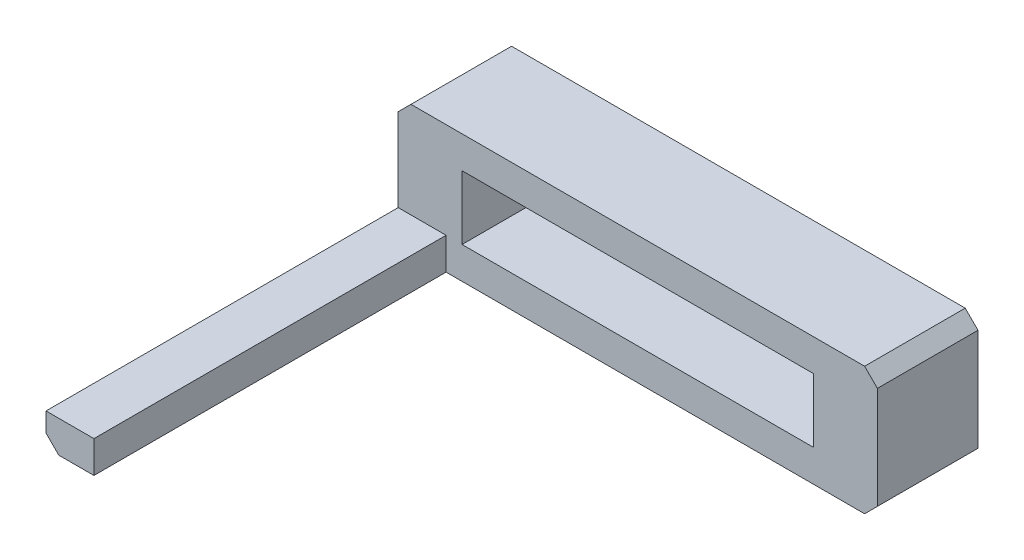
ISO-10303-21;
HEADER;
FILE_DESCRIPTION(('STEP AP214'),'2;1');
FILE_NAME('part.step','',(''),(''),'','','');
FILE_SCHEMA(('AUTOMOTIVE_DESIGN { 1 0 10303 214 1 1 1 1 }'));
ENDSEC;
DATA;
#1=APPLICATION_CONTEXT('core data for automotive mechanical design processes');
#2=APPLICATION_PROTOCOL_DEFINITION('international standard','automotive_design',2000,#1);
#3=PRODUCT_CONTEXT('',#1,'mechanical');
#4=PRODUCT('Part','Part','',(#3));
#5=PRODUCT_RELATED_PRODUCT_CATEGORY('part','',(#4));
#6=PRODUCT_DEFINITION_FORMATION('','',#4);
#7=PRODUCT_DEFINITION_CONTEXT('part definition',#1,'design');
#8=PRODUCT_DEFINITION('design','',#6,#7);
#9=PRODUCT_DEFINITION_SHAPE('','',#8);
#10=(LENGTH_UNIT() NAMED_UNIT(*) SI_UNIT(.MILLI.,.METRE.));
#11=(NAMED_UNIT(*) PLANE_ANGLE_UNIT() SI_UNIT($,.RADIAN.));
#12=(NAMED_UNIT(*) SI_UNIT($,.STERADIAN.) SOLID_ANGLE_UNIT());
#13=UNCERTAINTY_MEASURE_WITH_UNIT(LENGTH_MEASURE(1.E-05),#10,'distance_accuracy_value','');
#14=(GEOMETRIC_REPRESENTATION_CONTEXT(3) GLOBAL_UNCERTAINTY_ASSIGNED_CONTEXT((#13)) GLOBAL_UNIT_ASSIGNED_CONTEXT((#10,
#11,#12)) REPRESENTATION_CONTEXT('',''));
#15=CARTESIAN_POINT('',(0.,0.,0.));
#16=DIRECTION('',(0.,0.,1.));
#17=DIRECTION('',(1.,0.,0.));
#18=AXIS2_PLACEMENT_3D('',#15,#16,#17);
#19=CARTESIAN_POINT('',(-95.25,0.,20.));
#20=DIRECTION('',(-1.,0.,0.));
#21=DIRECTION('',(0.,0.,1.));
#22=AXIS2_PLACEMENT_3D('',#19,#20,#21);
#23=PLANE('',#22);
#24=DIRECTION('',(0.,1.,0.));
#25=VECTOR('',#24,1.);
#26=CARTESIAN_POINT('',(-95.25,0.,20.));
#27=LINE('',#26,#25);
#28=CARTESIAN_POINT('',(-95.25,6.35,20.));
#29=VERTEX_POINT('',#28);
#30=CARTESIAN_POINT('',(-95.25,22.86,20.));
#31=VERTEX_POINT('',#30);
#32=EDGE_CURVE('E190',#29,#31,#27,.T.);
#33=ORIENTED_EDGE('',*,*,#32,.T.);
#34=DIRECTION('',(0.,0.,-1.));
#35=VECTOR('',#34,1.);
#36=CARTESIAN_POINT('',(-95.25,22.86,0.));
#37=LINE('',#36,#35);
#38=CARTESIAN_POINT('',(-95.25,22.86,0.));
#39=VERTEX_POINT('',#38);
#40=EDGE_CURVE('E255',#31,#39,#37,.T.);
#41=ORIENTED_EDGE('',*,*,#40,.T.);
#42=DIRECTION('',(0.,1.,0.));
#43=VECTOR('',#42,1.);
#44=CARTESIAN_POINT('',(-95.25,0.,0.));
#45=LINE('',#44,#43);
#46=CARTESIAN_POINT('',(-95.25,2.54000000000001,0.));
#47=VERTEX_POINT('',#46);
#48=EDGE_CURVE('E211',#47,#39,#45,.T.);
#49=ORIENTED_EDGE('',*,*,#48,.F.);
#50=DIRECTION('',(0.,0.,1.));
#51=VECTOR('',#50,1.);
#52=CARTESIAN_POINT('',(-95.25,2.54000000000001,20.));
#53=LINE('',#52,#51);
#54=CARTESIAN_POINT('',(-95.25,2.54000000000001,90.));
#55=VERTEX_POINT('',#54);
#56=EDGE_CURVE('E56',#47,#55,#53,.T.);
#57=ORIENTED_EDGE('',*,*,#56,.T.);
#58=DIRECTION('',(0.,-1.,0.));
#59=VECTOR('',#58,1.);
#60=CARTESIAN_POINT('',(-95.25,0.,90.));
#61=LINE('',#60,#59);
#62=CARTESIAN_POINT('',(-95.25,6.35,90.));
#63=VERTEX_POINT('',#62);
#64=EDGE_CURVE('E148',#63,#55,#61,.T.);
#65=ORIENTED_EDGE('',*,*,#64,.F.);
#66=DIRECTION('',(0.,0.,-1.));
#67=VECTOR('',#66,1.);
#68=CARTESIAN_POINT('',(-95.25,6.35,90.));
#69=LINE('',#68,#67);
#70=EDGE_CURVE('E167',#63,#29,#69,.T.);
#71=ORIENTED_EDGE('',*,*,#70,.T.);
#72=EDGE_LOOP('',(#33,#41,#49,#57,#65,#71));
#73=FACE_BOUND('',#72,.T.);
#74=ADVANCED_FACE('F35',(#73),#23,.T.);
#75=CARTESIAN_POINT('',(0.,0.,20.));
#76=DIRECTION('',(0.,-1.,0.));
#77=DIRECTION('',(0.,0.,-1.));
#78=AXIS2_PLACEMENT_3D('',#75,#76,#77);
#79=PLANE('',#78);
#80=DIRECTION('',(-1.,0.,0.));
#81=VECTOR('',#80,1.);
#82=CARTESIAN_POINT('',(0.,0.,0.));
#83=LINE('',#82,#81);
#84=CARTESIAN_POINT('',(-2.53999999999999,0.,0.));
#85=VERTEX_POINT('',#84);
#86=CARTESIAN_POINT('',(-92.71,0.,0.));
#87=VERTEX_POINT('',#86);
#88=EDGE_CURVE('E214',#85,#87,#83,.T.);
#89=ORIENTED_EDGE('',*,*,#88,.F.);
#90=DIRECTION('',(0.,0.,1.));
#91=VECTOR('',#90,1.);
#92=CARTESIAN_POINT('',(-2.53999999999999,0.,20.));
#93=LINE('',#92,#91);
#94=CARTESIAN_POINT('',(-2.53999999999999,0.,20.));
#95=VERTEX_POINT('',#94);
#96=EDGE_CURVE('E43',#85,#95,#93,.T.);
#97=ORIENTED_EDGE('',*,*,#96,.T.);
#98=DIRECTION('',(-1.,0.,0.));
#99=VECTOR('',#98,1.);
#100=CARTESIAN_POINT('',(0.,0.,20.));
#101=LINE('',#100,#99);
#102=CARTESIAN_POINT('',(-85.725,0.,20.));
#103=VERTEX_POINT('',#102);
#104=EDGE_CURVE('E155',#95,#103,#101,.T.);
#105=ORIENTED_EDGE('',*,*,#104,.T.);
#106=DIRECTION('',(0.,0.,-1.));
#107=VECTOR('',#106,1.);
#108=CARTESIAN_POINT('',(-85.725,0.,90.));
#109=LINE('',#108,#107);
#110=CARTESIAN_POINT('',(-85.725,0.,90.));
#111=VERTEX_POINT('',#110);
#112=EDGE_CURVE('E151',#111,#103,#109,.T.);
#113=ORIENTED_EDGE('',*,*,#112,.F.);
#114=DIRECTION('',(1.,0.,0.));
#115=VECTOR('',#114,1.);
#116=CARTESIAN_POINT('',(-95.25,0.,90.));
#117=LINE('',#116,#115);
#118=CARTESIAN_POINT('',(-92.71,0.,90.));
#119=VERTEX_POINT('',#118);
#120=EDGE_CURVE('E139',#119,#111,#117,.T.);
#121=ORIENTED_EDGE('',*,*,#120,.F.);
#122=DIRECTION('',(0.,0.,-1.));
#123=VECTOR('',#122,1.);
#124=CARTESIAN_POINT('',(-92.71,0.,20.));
#125=LINE('',#124,#123);
#126=EDGE_CURVE('E258',#119,#87,#125,.T.);
#127=ORIENTED_EDGE('',*,*,#126,.T.);
#128=EDGE_LOOP('',(#89,#97,#105,#113,#121,#127));
#129=FACE_BOUND('',#128,.T.);
#130=ADVANCED_FACE('F153',(#129),#79,.T.);
#131=CARTESIAN_POINT('',(0.,0.,20.));
#132=DIRECTION('',(-1.,0.,0.));
#133=DIRECTION('',(0.,0.,1.));
#134=AXIS2_PLACEMENT_3D('',#131,#132,#133);
#135=PLANE('',#134);
#136=DIRECTION('',(0.,1.,0.));
#137=VECTOR('',#136,1.);
#138=CARTESIAN_POINT('',(0.,0.,0.));
#139=LINE('',#138,#137);
#140=CARTESIAN_POINT('',(0.,2.53999999999997,0.));
#141=VERTEX_POINT('',#140);
#142=CARTESIAN_POINT('',(0.,22.86,0.));
#143=VERTEX_POINT('',#142);
#144=EDGE_CURVE('E217',#141,#143,#139,.T.);
#145=ORIENTED_EDGE('',*,*,#144,.T.);
#146=DIRECTION('',(0.,0.,1.));
#147=VECTOR('',#146,1.);
#148=CARTESIAN_POINT('',(0.,22.86,20.));
#149=LINE('',#148,#147);
#150=CARTESIAN_POINT('',(0.,22.86,20.));
#151=VERTEX_POINT('',#150);
#152=EDGE_CURVE('E246',#143,#151,#149,.T.);
#153=ORIENTED_EDGE('',*,*,#152,.T.);
#154=DIRECTION('',(0.,1.,0.));
#155=VECTOR('',#154,1.);
#156=CARTESIAN_POINT('',(0.,0.,20.));
#157=LINE('',#156,#155);
#158=CARTESIAN_POINT('',(0.,2.53999999999997,20.));
#159=VERTEX_POINT('',#158);
#160=EDGE_CURVE('E194',#159,#151,#157,.T.);
#161=ORIENTED_EDGE('',*,*,#160,.F.);
#162=DIRECTION('',(0.,0.,-1.));
#163=VECTOR('',#162,1.);
#164=CARTESIAN_POINT('',(0.,2.53999999999997,0.));
#165=LINE('',#164,#163);
#166=EDGE_CURVE('E243',#159,#141,#165,.T.);
#167=ORIENTED_EDGE('',*,*,#166,.T.);
#168=EDGE_LOOP('',(#145,#153,#161,#167));
#169=FACE_BOUND('',#168,.T.);
#170=ADVANCED_FACE('F270',(#169),#135,.F.);
#171=CARTESIAN_POINT('',(-82.55,0.,20.));
#172=DIRECTION('',(1.,0.,0.));
#173=DIRECTION('',(0.,1.,0.));
#174=AXIS2_PLACEMENT_3D('',#171,#172,#173);
#175=PLANE('',#174);
#176=DIRECTION('',(0.,-1.,0.));
#177=VECTOR('',#176,1.);
#178=CARTESIAN_POINT('',(-82.55,0.,0.));
#179=LINE('',#178,#177);
#180=CARTESIAN_POINT('',(-82.55,19.05,0.));
#181=VERTEX_POINT('',#180);
#182=CARTESIAN_POINT('',(-82.55,6.34999999999999,0.));
#183=VERTEX_POINT('',#182);
#184=EDGE_CURVE('E159',#181,#183,#179,.T.);
#185=ORIENTED_EDGE('',*,*,#184,.F.);
#186=DIRECTION('',(0.,0.,-1.));
#187=VECTOR('',#186,1.);
#188=CARTESIAN_POINT('',(-82.55,19.05,20.));
#189=LINE('',#188,#187);
#190=CARTESIAN_POINT('',(-82.55,19.05,20.));
#191=VERTEX_POINT('',#190);
#192=EDGE_CURVE('E228',#191,#181,#189,.T.);
#193=ORIENTED_EDGE('',*,*,#192,.F.);
#194=DIRECTION('',(0.,-1.,0.));
#195=VECTOR('',#194,1.);
#196=CARTESIAN_POINT('',(-82.55,0.,20.));
#197=LINE('',#196,#195);
#198=CARTESIAN_POINT('',(-82.55,6.34999999999999,20.));
#199=VERTEX_POINT('',#198);
#200=EDGE_CURVE('E179',#191,#199,#197,.T.);
#201=ORIENTED_EDGE('',*,*,#200,.T.);
#202=DIRECTION('',(0.,0.,-1.));
#203=VECTOR('',#202,1.);
#204=CARTESIAN_POINT('',(-82.55,6.34999999999999,20.));
#205=LINE('',#204,#203);
#206=EDGE_CURVE('E200',#199,#183,#205,.T.);
#207=ORIENTED_EDGE('',*,*,#206,.T.);
#208=EDGE_LOOP('',(#185,#193,#201,#207));
#209=FACE_BOUND('',#208,.T.);
#210=ADVANCED_FACE('F311',(#209),#175,.T.);
#211=CARTESIAN_POINT('',(0.,19.05,20.));
#212=DIRECTION('',(0.,-1.,0.));
#213=DIRECTION('',(0.,0.,-1.));
#214=AXIS2_PLACEMENT_3D('',#211,#212,#213);
#215=PLANE('',#214);
#216=DIRECTION('',(-1.,0.,0.));
#217=VECTOR('',#216,1.);
#218=CARTESIAN_POINT('',(0.,19.05,0.));
#219=LINE('',#218,#217);
#220=CARTESIAN_POINT('',(-12.7,19.05,0.));
#221=VERTEX_POINT('',#220);
#222=EDGE_CURVE('E203',#221,#181,#219,.T.);
#223=ORIENTED_EDGE('',*,*,#222,.F.);
#224=DIRECTION('',(0.,0.,-1.));
#225=VECTOR('',#224,1.);
#226=CARTESIAN_POINT('',(-12.7,19.05,20.));
#227=LINE('',#226,#225);
#228=CARTESIAN_POINT('',(-12.7,19.05,20.));
#229=VERTEX_POINT('',#228);
#230=EDGE_CURVE('E226',#229,#221,#227,.T.);
#231=ORIENTED_EDGE('',*,*,#230,.F.);
#232=DIRECTION('',(-1.,0.,0.));
#233=VECTOR('',#232,1.);
#234=CARTESIAN_POINT('',(0.,19.05,20.));
#235=LINE('',#234,#233);
#236=EDGE_CURVE('E182',#229,#191,#235,.T.);
#237=ORIENTED_EDGE('',*,*,#236,.T.);
#238=ORIENTED_EDGE('',*,*,#192,.T.);
#239=EDGE_LOOP('',(#223,#231,#237,#238));
#240=FACE_BOUND('',#239,.T.);
#241=ADVANCED_FACE('F307',(#240),#215,.T.);
#242=CARTESIAN_POINT('',(-12.7,0.,20.));
#243=DIRECTION('',(1.,0.,0.));
#244=DIRECTION('',(0.,1.,0.));
#245=AXIS2_PLACEMENT_3D('',#242,#243,#244);
#246=PLANE('',#245);
#247=DIRECTION('',(0.,-1.,0.));
#248=VECTOR('',#247,1.);
#249=CARTESIAN_POINT('',(-12.7,0.,0.));
#250=LINE('',#249,#248);
#251=CARTESIAN_POINT('',(-12.7,6.34999999999999,0.));
#252=VERTEX_POINT('',#251);
#253=EDGE_CURVE('E206',#221,#252,#250,.T.);
#254=ORIENTED_EDGE('',*,*,#253,.T.);
#255=DIRECTION('',(0.,0.,-1.));
#256=VECTOR('',#255,1.);
#257=CARTESIAN_POINT('',(-12.7,6.34999999999999,20.));
#258=LINE('',#257,#256);
#259=CARTESIAN_POINT('',(-12.7,6.34999999999999,20.));
#260=VERTEX_POINT('',#259);
#261=EDGE_CURVE('E223',#260,#252,#258,.T.);
#262=ORIENTED_EDGE('',*,*,#261,.F.);
#263=DIRECTION('',(0.,-1.,0.));
#264=VECTOR('',#263,1.);
#265=CARTESIAN_POINT('',(-12.7,0.,20.));
#266=LINE('',#265,#264);
#267=EDGE_CURVE('E186',#229,#260,#266,.T.);
#268=ORIENTED_EDGE('',*,*,#267,.F.);
#269=ORIENTED_EDGE('',*,*,#230,.T.);
#270=EDGE_LOOP('',(#254,#262,#268,#269));
#271=FACE_BOUND('',#270,.T.);
#272=ADVANCED_FACE('F303',(#271),#246,.F.);
#273=CARTESIAN_POINT('',(0.,6.34999999999999,20.));
#274=DIRECTION('',(0.,-1.,0.));
#275=DIRECTION('',(0.,0.,-1.));
#276=AXIS2_PLACEMENT_3D('',#273,#274,#275);
#277=PLANE('',#276);
#278=DIRECTION('',(-1.,0.,0.));
#279=VECTOR('',#278,1.);
#280=CARTESIAN_POINT('',(0.,6.34999999999999,0.));
#281=LINE('',#280,#279);
#282=EDGE_CURVE('E208',#252,#183,#281,.T.);
#283=ORIENTED_EDGE('',*,*,#282,.T.);
#284=ORIENTED_EDGE('',*,*,#206,.F.);
#285=DIRECTION('',(-1.,0.,0.));
#286=VECTOR('',#285,1.);
#287=CARTESIAN_POINT('',(0.,6.34999999999999,20.));
#288=LINE('',#287,#286);
#289=EDGE_CURVE('E188',#260,#199,#288,.T.);
#290=ORIENTED_EDGE('',*,*,#289,.F.);
#291=ORIENTED_EDGE('',*,*,#261,.T.);
#292=EDGE_LOOP('',(#283,#284,#290,#291));
#293=FACE_BOUND('',#292,.T.);
#294=ADVANCED_FACE('F300',(#293),#277,.F.);
#295=CARTESIAN_POINT('',(0.,25.4,20.));
#296=DIRECTION('',(0.,-1.,0.));
#297=DIRECTION('',(0.,0.,-1.));
#298=AXIS2_PLACEMENT_3D('',#295,#296,#297);
#299=PLANE('',#298);
#300=DIRECTION('',(-1.,0.,0.));
#301=VECTOR('',#300,1.);
#302=CARTESIAN_POINT('',(0.,25.4,20.));
#303=LINE('',#302,#301);
#304=CARTESIAN_POINT('',(-2.54,25.4,20.));
#305=VERTEX_POINT('',#304);
#306=CARTESIAN_POINT('',(-92.71,25.4,20.));
#307=VERTEX_POINT('',#306);
#308=EDGE_CURVE('E197',#305,#307,#303,.T.);
#309=ORIENTED_EDGE('',*,*,#308,.F.);
#310=DIRECTION('',(0.,0.,-1.));
#311=VECTOR('',#310,1.);
#312=CARTESIAN_POINT('',(-2.54,25.4,20.));
#313=LINE('',#312,#311);
#314=CARTESIAN_POINT('',(-2.54,25.4,0.));
#315=VERTEX_POINT('',#314);
#316=EDGE_CURVE('E232',#305,#315,#313,.T.);
#317=ORIENTED_EDGE('',*,*,#316,.T.);
#318=DIRECTION('',(-1.,0.,0.));
#319=VECTOR('',#318,1.);
#320=CARTESIAN_POINT('',(0.,25.4,0.));
#321=LINE('',#320,#319);
#322=CARTESIAN_POINT('',(-92.71,25.4,0.));
#323=VERTEX_POINT('',#322);
#324=EDGE_CURVE('E183',#315,#323,#321,.T.);
#325=ORIENTED_EDGE('',*,*,#324,.T.);
#326=DIRECTION('',(0.,0.,1.));
#327=VECTOR('',#326,1.);
#328=CARTESIAN_POINT('',(-92.71,25.4,20.));
#329=LINE('',#328,#327);
#330=EDGE_CURVE('E230',#323,#307,#329,.T.);
#331=ORIENTED_EDGE('',*,*,#330,.T.);
#332=EDGE_LOOP('',(#309,#317,#325,#331));
#333=FACE_BOUND('',#332,.T.);
#334=ADVANCED_FACE('F281',(#333),#299,.F.);
#335=CARTESIAN_POINT('',(0.,0.,20.));
#336=DIRECTION('',(0.,0.,1.));
#337=DIRECTION('',(1.,0.,0.));
#338=AXIS2_PLACEMENT_3D('',#335,#336,#337);
#339=PLANE('',#338);
#340=ORIENTED_EDGE('',*,*,#160,.T.);
#341=DIRECTION('',(0.707106781186546,-0.70710678118655,0.));
#342=VECTOR('',#341,1.);
#343=CARTESIAN_POINT('',(11.43,11.4299999999999,20.));
#344=LINE('',#343,#342);
#345=EDGE_CURVE('E252',#151,#305,#344,.F.);
#346=ORIENTED_EDGE('',*,*,#345,.T.);
#347=ORIENTED_EDGE('',*,*,#308,.T.);
#348=DIRECTION('',(-0.707106781186549,-0.707106781186546,0.));
#349=VECTOR('',#348,1.);
#350=CARTESIAN_POINT('',(-59.0549999999997,59.0550000000001,20.));
#351=LINE('',#350,#349);
#352=EDGE_CURVE('E250',#307,#31,#351,.T.);
#353=ORIENTED_EDGE('',*,*,#352,.T.);
#354=ORIENTED_EDGE('',*,*,#32,.F.);
#355=DIRECTION('',(-1.,0.,0.));
#356=VECTOR('',#355,1.);
#357=CARTESIAN_POINT('',(-95.25,6.35,20.));
#358=LINE('',#357,#356);
#359=CARTESIAN_POINT('',(-85.725,6.35,20.));
#360=VERTEX_POINT('',#359);
#361=EDGE_CURVE('E173',#360,#29,#358,.T.);
#362=ORIENTED_EDGE('',*,*,#361,.F.);
#363=DIRECTION('',(0.,1.,0.));
#364=VECTOR('',#363,1.);
#365=CARTESIAN_POINT('',(-85.725,0.,20.));
#366=LINE('',#365,#364);
#367=EDGE_CURVE('E171',#103,#360,#366,.T.);
#368=ORIENTED_EDGE('',*,*,#367,.F.);
#369=ORIENTED_EDGE('',*,*,#104,.F.);
#370=DIRECTION('',(0.707106781186549,0.707106781186546,0.));
#371=VECTOR('',#370,1.);
#372=CARTESIAN_POINT('',(-1.26999999999999,1.26999999999999,20.));
#373=LINE('',#372,#371);
#374=EDGE_CURVE('E248',#95,#159,#373,.T.);
#375=ORIENTED_EDGE('',*,*,#374,.T.);
#376=EDGE_LOOP('',(#340,#346,#347,#353,#354,#362,#368,#369,#375));
#377=FACE_BOUND('',#376,.T.);
#378=ORIENTED_EDGE('',*,*,#200,.F.);
#379=ORIENTED_EDGE('',*,*,#236,.F.);
#380=ORIENTED_EDGE('',*,*,#267,.T.);
#381=ORIENTED_EDGE('',*,*,#289,.T.);
#382=EDGE_LOOP('',(#378,#379,#380,#381));
#383=FACE_BOUND('',#382,.T.);
#384=ADVANCED_FACE('F263',(#377,#383),#339,.T.);
#385=CARTESIAN_POINT('',(0.,0.,0.));
#386=DIRECTION('',(0.,0.,1.));
#387=DIRECTION('',(1.,0.,0.));
#388=AXIS2_PLACEMENT_3D('',#385,#386,#387);
#389=PLANE('',#388);
#390=ORIENTED_EDGE('',*,*,#184,.T.);
#391=ORIENTED_EDGE('',*,*,#282,.F.);
#392=ORIENTED_EDGE('',*,*,#253,.F.);
#393=ORIENTED_EDGE('',*,*,#222,.T.);
#394=EDGE_LOOP('',(#390,#391,#392,#393));
#395=FACE_BOUND('',#394,.T.);
#396=ORIENTED_EDGE('',*,*,#324,.F.);
#397=DIRECTION('',(-0.707106781186546,0.70710678118655,0.));
#398=VECTOR('',#397,1.);
#399=CARTESIAN_POINT('',(-2.54,25.4,0.));
#400=LINE('',#399,#398);
#401=EDGE_CURVE('E241',#315,#143,#400,.F.);
#402=ORIENTED_EDGE('',*,*,#401,.T.);
#403=ORIENTED_EDGE('',*,*,#144,.F.);
#404=DIRECTION('',(-0.707106781186549,-0.707106781186546,0.));
#405=VECTOR('',#404,1.);
#406=CARTESIAN_POINT('',(0.,2.53999999999997,0.));
#407=LINE('',#406,#405);
#408=EDGE_CURVE('E237',#141,#85,#407,.T.);
#409=ORIENTED_EDGE('',*,*,#408,.T.);
#410=ORIENTED_EDGE('',*,*,#88,.T.);
#411=DIRECTION('',(0.707106781186546,-0.70710678118655,0.));
#412=VECTOR('',#411,1.);
#413=CARTESIAN_POINT('',(-92.71,0.,0.));
#414=LINE('',#413,#412);
#415=EDGE_CURVE('E235',#87,#47,#414,.F.);
#416=ORIENTED_EDGE('',*,*,#415,.T.);
#417=ORIENTED_EDGE('',*,*,#48,.T.);
#418=DIRECTION('',(0.707106781186549,0.707106781186546,0.));
#419=VECTOR('',#418,1.);
#420=CARTESIAN_POINT('',(-95.25,22.86,0.));
#421=LINE('',#420,#419);
#422=EDGE_CURVE('E239',#39,#323,#421,.T.);
#423=ORIENTED_EDGE('',*,*,#422,.T.);
#424=EDGE_LOOP('',(#396,#402,#403,#409,#410,#416,#417,#423));
#425=FACE_BOUND('',#424,.T.);
#426=ADVANCED_FACE('F274',(#395,#425),#389,.F.);
#427=CARTESIAN_POINT('',(-85.725,0.,90.));
#428=DIRECTION('',(-1.,0.,0.));
#429=DIRECTION('',(0.,0.,1.));
#430=AXIS2_PLACEMENT_3D('',#427,#428,#429);
#431=PLANE('',#430);
#432=ORIENTED_EDGE('',*,*,#367,.T.);
#433=DIRECTION('',(0.,0.,-1.));
#434=VECTOR('',#433,1.);
#435=CARTESIAN_POINT('',(-85.725,6.35,90.));
#436=LINE('',#435,#434);
#437=CARTESIAN_POINT('',(-85.725,6.35,90.));
#438=VERTEX_POINT('',#437);
#439=EDGE_CURVE('E160',#438,#360,#436,.T.);
#440=ORIENTED_EDGE('',*,*,#439,.F.);
#441=DIRECTION('',(0.,1.,0.));
#442=VECTOR('',#441,1.);
#443=CARTESIAN_POINT('',(-85.725,0.,90.));
#444=LINE('',#443,#442);
#445=EDGE_CURVE('E143',#111,#438,#444,.T.);
#446=ORIENTED_EDGE('',*,*,#445,.F.);
#447=ORIENTED_EDGE('',*,*,#112,.T.);
#448=EDGE_LOOP('',(#432,#440,#446,#447));
#449=FACE_BOUND('',#448,.T.);
#450=ADVANCED_FACE('F162',(#449),#431,.F.);
#451=CARTESIAN_POINT('',(-95.25,6.35,90.));
#452=DIRECTION('',(0.,-1.,0.));
#453=DIRECTION('',(0.,0.,-1.));
#454=AXIS2_PLACEMENT_3D('',#451,#452,#453);
#455=PLANE('',#454);
#456=ORIENTED_EDGE('',*,*,#361,.T.);
#457=ORIENTED_EDGE('',*,*,#70,.F.);
#458=DIRECTION('',(-1.,0.,0.));
#459=VECTOR('',#458,1.);
#460=CARTESIAN_POINT('',(-95.25,6.35,90.));
#461=LINE('',#460,#459);
#462=EDGE_CURVE('E165',#438,#63,#461,.T.);
#463=ORIENTED_EDGE('',*,*,#462,.F.);
#464=ORIENTED_EDGE('',*,*,#439,.T.);
#465=EDGE_LOOP('',(#456,#457,#463,#464));
#466=FACE_BOUND('',#465,.T.);
#467=ADVANCED_FACE('F347',(#466),#455,.F.);
#468=CARTESIAN_POINT('',(0.,0.,90.));
#469=DIRECTION('',(0.,0.,-1.));
#470=DIRECTION('',(-1.,0.,0.));
#471=AXIS2_PLACEMENT_3D('',#468,#469,#470);
#472=PLANE('',#471);
#473=ORIENTED_EDGE('',*,*,#64,.T.);
#474=DIRECTION('',(-0.707106781186546,0.70710678118655,0.));
#475=VECTOR('',#474,1.);
#476=CARTESIAN_POINT('',(-92.71,0.,90.));
#477=LINE('',#476,#475);
#478=EDGE_CURVE('E11',#55,#119,#477,.F.);
#479=ORIENTED_EDGE('',*,*,#478,.T.);
#480=ORIENTED_EDGE('',*,*,#120,.T.);
#481=ORIENTED_EDGE('',*,*,#445,.T.);
#482=ORIENTED_EDGE('',*,*,#462,.T.);
#483=EDGE_LOOP('',(#473,#479,#480,#481,#482));
#484=FACE_BOUND('',#483,.T.);
#485=ADVANCED_FACE('F141',(#484),#472,.F.);
#486=CARTESIAN_POINT('',(-2.54,25.4,20.));
#487=DIRECTION('',(-0.70710678118655,-0.707106781186546,0.));
#488=DIRECTION('',(0.,0.,-1.));
#489=AXIS2_PLACEMENT_3D('',#486,#487,#488);
#490=PLANE('',#489);
#491=ORIENTED_EDGE('',*,*,#345,.F.);
#492=ORIENTED_EDGE('',*,*,#152,.F.);
#493=ORIENTED_EDGE('',*,*,#401,.F.);
#494=ORIENTED_EDGE('',*,*,#316,.F.);
#495=EDGE_LOOP('',(#491,#492,#493,#494));
#496=FACE_BOUND('',#495,.T.);
#497=ADVANCED_FACE('F278',(#496),#490,.F.);
#498=CARTESIAN_POINT('',(-95.25,22.86,20.));
#499=DIRECTION('',(-0.707106781186546,0.707106781186549,0.));
#500=DIRECTION('',(0.,0.,1.));
#501=AXIS2_PLACEMENT_3D('',#498,#499,#500);
#502=PLANE('',#501);
#503=ORIENTED_EDGE('',*,*,#352,.F.);
#504=ORIENTED_EDGE('',*,*,#330,.F.);
#505=ORIENTED_EDGE('',*,*,#422,.F.);
#506=ORIENTED_EDGE('',*,*,#40,.F.);
#507=EDGE_LOOP('',(#503,#504,#505,#506));
#508=FACE_BOUND('',#507,.T.);
#509=ADVANCED_FACE('F286',(#508),#502,.T.);
#510=CARTESIAN_POINT('',(0.,2.53999999999997,20.));
#511=DIRECTION('',(0.707106781186546,-0.707106781186549,0.));
#512=DIRECTION('',(0.,0.,1.));
#513=AXIS2_PLACEMENT_3D('',#510,#511,#512);
#514=PLANE('',#513);
#515=ORIENTED_EDGE('',*,*,#374,.F.);
#516=ORIENTED_EDGE('',*,*,#96,.F.);
#517=ORIENTED_EDGE('',*,*,#408,.F.);
#518=ORIENTED_EDGE('',*,*,#166,.F.);
#519=EDGE_LOOP('',(#515,#516,#517,#518));
#520=FACE_BOUND('',#519,.T.);
#521=ADVANCED_FACE('F267',(#520),#514,.T.);
#522=CARTESIAN_POINT('',(-92.71,0.,20.));
#523=DIRECTION('',(0.70710678118655,0.707106781186546,0.));
#524=DIRECTION('',(0.,0.,-1.));
#525=AXIS2_PLACEMENT_3D('',#522,#523,#524);
#526=PLANE('',#525);
#527=ORIENTED_EDGE('',*,*,#478,.F.);
#528=ORIENTED_EDGE('',*,*,#56,.F.);
#529=ORIENTED_EDGE('',*,*,#415,.F.);
#530=ORIENTED_EDGE('',*,*,#126,.F.);
#531=EDGE_LOOP('',(#527,#528,#529,#530));
#532=FACE_BOUND('',#531,.T.);
#533=ADVANCED_FACE('F37',(#532),#526,.F.);
#534=CLOSED_SHELL('',(#74,#130,#170,#210,#241,#272,#294,#334,#384,#426,#450,#467,#485,#497,#509,
#521,#533));
#535=MANIFOLD_SOLID_BREP('B2',#534);
#536=ADVANCED_BREP_SHAPE_REPRESENTATION('',(#18,#535),#14);
#537=SHAPE_DEFINITION_REPRESENTATION(#9,#536);
ENDSEC;
END-ISO-10303-21;
